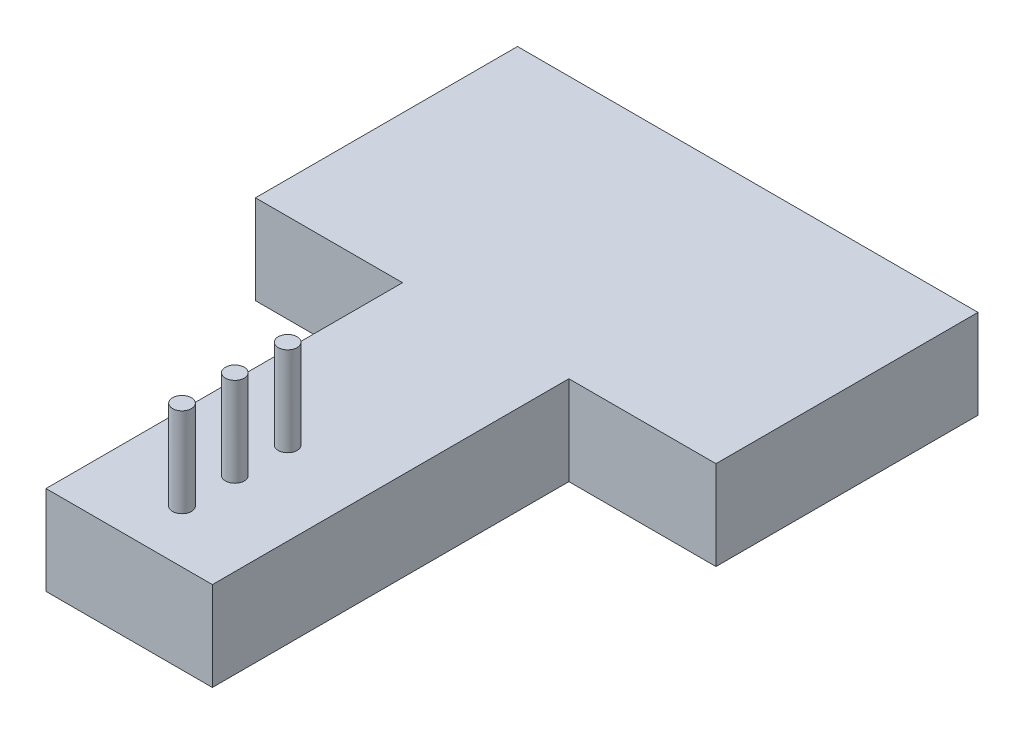
ISO-10303-21;
HEADER;
FILE_DESCRIPTION(('STEP AP214'),'2;1');
FILE_NAME('part.step','',(''),(''),'','','');
FILE_SCHEMA(('AUTOMOTIVE_DESIGN { 1 0 10303 214 1 1 1 1 }'));
ENDSEC;
DATA;
#1=APPLICATION_CONTEXT('core data for automotive mechanical design processes');
#2=APPLICATION_PROTOCOL_DEFINITION('international standard','automotive_design',2000,#1);
#3=PRODUCT_CONTEXT('',#1,'mechanical');
#4=PRODUCT('Part','Part','',(#3));
#5=PRODUCT_RELATED_PRODUCT_CATEGORY('part','',(#4));
#6=PRODUCT_DEFINITION_FORMATION('','',#4);
#7=PRODUCT_DEFINITION_CONTEXT('part definition',#1,'design');
#8=PRODUCT_DEFINITION('design','',#6,#7);
#9=PRODUCT_DEFINITION_SHAPE('','',#8);
#10=(LENGTH_UNIT() NAMED_UNIT(*) SI_UNIT(.MILLI.,.METRE.));
#11=(NAMED_UNIT(*) PLANE_ANGLE_UNIT() SI_UNIT($,.RADIAN.));
#12=(NAMED_UNIT(*) SI_UNIT($,.STERADIAN.) SOLID_ANGLE_UNIT());
#13=UNCERTAINTY_MEASURE_WITH_UNIT(LENGTH_MEASURE(1.E-05),#10,'distance_accuracy_value','');
#14=(GEOMETRIC_REPRESENTATION_CONTEXT(3) GLOBAL_UNCERTAINTY_ASSIGNED_CONTEXT((#13)) GLOBAL_UNIT_ASSIGNED_CONTEXT((#10,
#11,#12)) REPRESENTATION_CONTEXT('',''));
#15=CARTESIAN_POINT('',(0.,0.,0.));
#16=DIRECTION('',(0.,0.,1.));
#17=DIRECTION('',(1.,0.,0.));
#18=AXIS2_PLACEMENT_3D('',#15,#16,#17);
#19=CARTESIAN_POINT('',(-77.5,-30.,0.));
#20=DIRECTION('',(0.,0.,1.));
#21=DIRECTION('',(1.,0.,0.));
#22=AXIS2_PLACEMENT_3D('',#19,#20,#21);
#23=PLANE('',#22);
#24=DIRECTION('',(1.,0.,0.));
#25=VECTOR('',#24,1.);
#26=CARTESIAN_POINT('',(-77.5,0.,0.));
#27=LINE('',#26,#25);
#28=CARTESIAN_POINT('',(-77.5,0.,0.));
#29=VERTEX_POINT('',#28);
#30=CARTESIAN_POINT('',(-28.,0.,0.));
#31=VERTEX_POINT('',#30);
#32=EDGE_CURVE('E132',#29,#31,#27,.T.);
#33=ORIENTED_EDGE('',*,*,#32,.F.);
#34=DIRECTION('',(0.,1.,0.));
#35=VECTOR('',#34,1.);
#36=CARTESIAN_POINT('',(-77.5,-30.,0.));
#37=LINE('',#36,#35);
#38=CARTESIAN_POINT('',(-77.5,-30.,0.));
#39=VERTEX_POINT('',#38);
#40=EDGE_CURVE('E49',#39,#29,#37,.T.);
#41=ORIENTED_EDGE('',*,*,#40,.F.);
#42=DIRECTION('',(1.,0.,0.));
#43=VECTOR('',#42,1.);
#44=CARTESIAN_POINT('',(-77.5,-30.,0.));
#45=LINE('',#44,#43);
#46=CARTESIAN_POINT('',(-28.,-30.,0.));
#47=VERTEX_POINT('',#46);
#48=EDGE_CURVE('E154',#39,#47,#45,.T.);
#49=ORIENTED_EDGE('',*,*,#48,.T.);
#50=DIRECTION('',(0.,1.,0.));
#51=VECTOR('',#50,1.);
#52=CARTESIAN_POINT('',(-28.,-30.,0.));
#53=LINE('',#52,#51);
#54=EDGE_CURVE('E90',#47,#31,#53,.T.);
#55=ORIENTED_EDGE('',*,*,#54,.T.);
#56=EDGE_LOOP('',(#33,#41,#49,#55));
#57=FACE_BOUND('',#56,.T.);
#58=ADVANCED_FACE('F33',(#57),#23,.T.);
#59=CARTESIAN_POINT('',(-77.5,-30.,-88.2));
#60=DIRECTION('',(-1.,0.,0.));
#61=DIRECTION('',(0.,0.,1.));
#62=AXIS2_PLACEMENT_3D('',#59,#60,#61);
#63=PLANE('',#62);
#64=DIRECTION('',(0.,0.,1.));
#65=VECTOR('',#64,1.);
#66=CARTESIAN_POINT('',(-77.5,0.,-88.2));
#67=LINE('',#66,#65);
#68=CARTESIAN_POINT('',(-77.5,0.,-88.2));
#69=VERTEX_POINT('',#68);
#70=EDGE_CURVE('E151',#69,#29,#67,.T.);
#71=ORIENTED_EDGE('',*,*,#70,.F.);
#72=DIRECTION('',(0.,1.,0.));
#73=VECTOR('',#72,1.);
#74=CARTESIAN_POINT('',(-77.5,-30.,-88.2));
#75=LINE('',#74,#73);
#76=CARTESIAN_POINT('',(-77.5,-30.,-88.2));
#77=VERTEX_POINT('',#76);
#78=EDGE_CURVE('E78',#77,#69,#75,.T.);
#79=ORIENTED_EDGE('',*,*,#78,.F.);
#80=DIRECTION('',(0.,0.,1.));
#81=VECTOR('',#80,1.);
#82=CARTESIAN_POINT('',(-77.5,-30.,-88.2));
#83=LINE('',#82,#81);
#84=EDGE_CURVE('E122',#77,#39,#83,.T.);
#85=ORIENTED_EDGE('',*,*,#84,.T.);
#86=ORIENTED_EDGE('',*,*,#40,.T.);
#87=EDGE_LOOP('',(#71,#79,#85,#86));
#88=FACE_BOUND('',#87,.T.);
#89=ADVANCED_FACE('F195',(#88),#63,.T.);
#90=CARTESIAN_POINT('',(-77.5,-30.,-88.2));
#91=DIRECTION('',(0.,0.,-1.));
#92=DIRECTION('',(-1.,0.,0.));
#93=AXIS2_PLACEMENT_3D('',#90,#91,#92);
#94=PLANE('',#93);
#95=DIRECTION('',(-1.,0.,0.));
#96=VECTOR('',#95,1.);
#97=CARTESIAN_POINT('',(-77.5,0.,-88.2));
#98=LINE('',#97,#96);
#99=CARTESIAN_POINT('',(77.5,0.,-88.2));
#100=VERTEX_POINT('',#99);
#101=EDGE_CURVE('E109',#100,#69,#98,.T.);
#102=ORIENTED_EDGE('',*,*,#101,.F.);
#103=DIRECTION('',(0.,1.,0.));
#104=VECTOR('',#103,1.);
#105=CARTESIAN_POINT('',(77.5,-30.,-88.2));
#106=LINE('',#105,#104);
#107=CARTESIAN_POINT('',(77.5,-30.,-88.2));
#108=VERTEX_POINT('',#107);
#109=EDGE_CURVE('E104',#108,#100,#106,.T.);
#110=ORIENTED_EDGE('',*,*,#109,.F.);
#111=DIRECTION('',(-1.,0.,0.));
#112=VECTOR('',#111,1.);
#113=CARTESIAN_POINT('',(-77.5,-30.,-88.2));
#114=LINE('',#113,#112);
#115=EDGE_CURVE('E107',#108,#77,#114,.T.);
#116=ORIENTED_EDGE('',*,*,#115,.T.);
#117=ORIENTED_EDGE('',*,*,#78,.T.);
#118=EDGE_LOOP('',(#102,#110,#116,#117));
#119=FACE_BOUND('',#118,.T.);
#120=ADVANCED_FACE('F106',(#119),#94,.T.);
#121=CARTESIAN_POINT('',(77.5,-30.,-88.2));
#122=DIRECTION('',(1.,0.,0.));
#123=DIRECTION('',(0.,0.,-1.));
#124=AXIS2_PLACEMENT_3D('',#121,#122,#123);
#125=PLANE('',#124);
#126=DIRECTION('',(0.,0.,-1.));
#127=VECTOR('',#126,1.);
#128=CARTESIAN_POINT('',(77.5,0.,-88.2));
#129=LINE('',#128,#127);
#130=CARTESIAN_POINT('',(77.5,0.,0.));
#131=VERTEX_POINT('',#130);
#132=EDGE_CURVE('E148',#131,#100,#129,.T.);
#133=ORIENTED_EDGE('',*,*,#132,.F.);
#134=DIRECTION('',(0.,1.,0.));
#135=VECTOR('',#134,1.);
#136=CARTESIAN_POINT('',(77.5,-30.,0.));
#137=LINE('',#136,#135);
#138=CARTESIAN_POINT('',(77.5,-30.,0.));
#139=VERTEX_POINT('',#138);
#140=EDGE_CURVE('E114',#139,#131,#137,.T.);
#141=ORIENTED_EDGE('',*,*,#140,.F.);
#142=DIRECTION('',(0.,0.,-1.));
#143=VECTOR('',#142,1.);
#144=CARTESIAN_POINT('',(77.5,-30.,-88.2));
#145=LINE('',#144,#143);
#146=EDGE_CURVE('E120',#139,#108,#145,.T.);
#147=ORIENTED_EDGE('',*,*,#146,.T.);
#148=ORIENTED_EDGE('',*,*,#109,.T.);
#149=EDGE_LOOP('',(#133,#141,#147,#148));
#150=FACE_BOUND('',#149,.T.);
#151=ADVANCED_FACE('F124',(#150),#125,.T.);
#152=CARTESIAN_POINT('',(28.,-30.,0.));
#153=DIRECTION('',(0.,0.,1.));
#154=DIRECTION('',(1.,0.,0.));
#155=AXIS2_PLACEMENT_3D('',#152,#153,#154);
#156=PLANE('',#155);
#157=DIRECTION('',(1.,0.,0.));
#158=VECTOR('',#157,1.);
#159=CARTESIAN_POINT('',(28.,0.,0.));
#160=LINE('',#159,#158);
#161=CARTESIAN_POINT('',(28.,0.,0.));
#162=VERTEX_POINT('',#161);
#163=EDGE_CURVE('E145',#162,#131,#160,.T.);
#164=ORIENTED_EDGE('',*,*,#163,.F.);
#165=DIRECTION('',(0.,1.,0.));
#166=VECTOR('',#165,1.);
#167=CARTESIAN_POINT('',(28.,-30.,0.));
#168=LINE('',#167,#166);
#169=CARTESIAN_POINT('',(28.,-30.,0.));
#170=VERTEX_POINT('',#169);
#171=EDGE_CURVE('E159',#170,#162,#168,.T.);
#172=ORIENTED_EDGE('',*,*,#171,.F.);
#173=DIRECTION('',(1.,0.,0.));
#174=VECTOR('',#173,1.);
#175=CARTESIAN_POINT('',(28.,-30.,0.));
#176=LINE('',#175,#174);
#177=EDGE_CURVE('E125',#170,#139,#176,.T.);
#178=ORIENTED_EDGE('',*,*,#177,.T.);
#179=ORIENTED_EDGE('',*,*,#140,.T.);
#180=EDGE_LOOP('',(#164,#172,#178,#179));
#181=FACE_BOUND('',#180,.T.);
#182=ADVANCED_FACE('F194',(#181),#156,.T.);
#183=CARTESIAN_POINT('',(28.,-30.,0.));
#184=DIRECTION('',(1.,0.,0.));
#185=DIRECTION('',(0.,0.,-1.));
#186=AXIS2_PLACEMENT_3D('',#183,#184,#185);
#187=PLANE('',#186);
#188=DIRECTION('',(0.,0.,-1.));
#189=VECTOR('',#188,1.);
#190=CARTESIAN_POINT('',(28.,0.,0.));
#191=LINE('',#190,#189);
#192=CARTESIAN_POINT('',(28.,0.,120.));
#193=VERTEX_POINT('',#192);
#194=EDGE_CURVE('E142',#193,#162,#191,.T.);
#195=ORIENTED_EDGE('',*,*,#194,.F.);
#196=DIRECTION('',(0.,1.,0.));
#197=VECTOR('',#196,1.);
#198=CARTESIAN_POINT('',(28.,-30.,120.));
#199=LINE('',#198,#197);
#200=CARTESIAN_POINT('',(28.,-30.,120.));
#201=VERTEX_POINT('',#200);
#202=EDGE_CURVE('E161',#201,#193,#199,.T.);
#203=ORIENTED_EDGE('',*,*,#202,.F.);
#204=DIRECTION('',(0.,0.,-1.));
#205=VECTOR('',#204,1.);
#206=CARTESIAN_POINT('',(28.,-30.,0.));
#207=LINE('',#206,#205);
#208=EDGE_CURVE('E127',#201,#170,#207,.T.);
#209=ORIENTED_EDGE('',*,*,#208,.T.);
#210=ORIENTED_EDGE('',*,*,#171,.T.);
#211=EDGE_LOOP('',(#195,#203,#209,#210));
#212=FACE_BOUND('',#211,.T.);
#213=ADVANCED_FACE('F190',(#212),#187,.T.);
#214=CARTESIAN_POINT('',(-28.,-30.,120.));
#215=DIRECTION('',(0.,0.,1.));
#216=DIRECTION('',(1.,0.,0.));
#217=AXIS2_PLACEMENT_3D('',#214,#215,#216);
#218=PLANE('',#217);
#219=DIRECTION('',(1.,0.,0.));
#220=VECTOR('',#219,1.);
#221=CARTESIAN_POINT('',(-28.,0.,120.));
#222=LINE('',#221,#220);
#223=CARTESIAN_POINT('',(-28.,0.,120.));
#224=VERTEX_POINT('',#223);
#225=EDGE_CURVE('E139',#224,#193,#222,.T.);
#226=ORIENTED_EDGE('',*,*,#225,.F.);
#227=DIRECTION('',(0.,1.,0.));
#228=VECTOR('',#227,1.);
#229=CARTESIAN_POINT('',(-28.,-30.,120.));
#230=LINE('',#229,#228);
#231=CARTESIAN_POINT('',(-28.,-30.,120.));
#232=VERTEX_POINT('',#231);
#233=EDGE_CURVE('E163',#232,#224,#230,.T.);
#234=ORIENTED_EDGE('',*,*,#233,.F.);
#235=DIRECTION('',(1.,0.,0.));
#236=VECTOR('',#235,1.);
#237=CARTESIAN_POINT('',(-28.,-30.,120.));
#238=LINE('',#237,#236);
#239=EDGE_CURVE('E254',#232,#201,#238,.T.);
#240=ORIENTED_EDGE('',*,*,#239,.T.);
#241=ORIENTED_EDGE('',*,*,#202,.T.);
#242=EDGE_LOOP('',(#226,#234,#240,#241));
#243=FACE_BOUND('',#242,.T.);
#244=ADVANCED_FACE('F186',(#243),#218,.T.);
#245=CARTESIAN_POINT('',(-28.,-30.,0.));
#246=DIRECTION('',(-1.,0.,0.));
#247=DIRECTION('',(0.,0.,1.));
#248=AXIS2_PLACEMENT_3D('',#245,#246,#247);
#249=PLANE('',#248);
#250=DIRECTION('',(0.,0.,1.));
#251=VECTOR('',#250,1.);
#252=CARTESIAN_POINT('',(-28.,0.,0.));
#253=LINE('',#252,#251);
#254=EDGE_CURVE('E135',#31,#224,#253,.T.);
#255=ORIENTED_EDGE('',*,*,#254,.F.);
#256=ORIENTED_EDGE('',*,*,#54,.F.);
#257=DIRECTION('',(0.,0.,1.));
#258=VECTOR('',#257,1.);
#259=CARTESIAN_POINT('',(-28.,-30.,0.));
#260=LINE('',#259,#258);
#261=EDGE_CURVE('E182',#47,#232,#260,.T.);
#262=ORIENTED_EDGE('',*,*,#261,.T.);
#263=ORIENTED_EDGE('',*,*,#233,.T.);
#264=EDGE_LOOP('',(#255,#256,#262,#263));
#265=FACE_BOUND('',#264,.T.);
#266=ADVANCED_FACE('F180',(#265),#249,.T.);
#267=CARTESIAN_POINT('',(0.,-30.,0.));
#268=DIRECTION('',(0.,-1.,0.));
#269=DIRECTION('',(0.,0.,-1.));
#270=AXIS2_PLACEMENT_3D('',#267,#268,#269);
#271=PLANE('',#270);
#272=ORIENTED_EDGE('',*,*,#48,.F.);
#273=ORIENTED_EDGE('',*,*,#84,.F.);
#274=ORIENTED_EDGE('',*,*,#115,.F.);
#275=ORIENTED_EDGE('',*,*,#146,.F.);
#276=ORIENTED_EDGE('',*,*,#177,.F.);
#277=ORIENTED_EDGE('',*,*,#208,.F.);
#278=ORIENTED_EDGE('',*,*,#239,.F.);
#279=ORIENTED_EDGE('',*,*,#261,.F.);
#280=EDGE_LOOP('',(#272,#273,#274,#275,#276,#277,#278,#279));
#281=FACE_BOUND('',#280,.T.);
#282=ADVANCED_FACE('F118',(#281),#271,.T.);
#283=CARTESIAN_POINT('',(0.,0.,0.));
#284=DIRECTION('',(0.,-1.,0.));
#285=DIRECTION('',(0.,0.,-1.));
#286=AXIS2_PLACEMENT_3D('',#283,#284,#285);
#287=PLANE('',#286);
#288=CARTESIAN_POINT('',(0.,0.,102.22));
#289=DIRECTION('',(0.,-1.,0.));
#290=DIRECTION('',(0.,0.,-1.));
#291=AXIS2_PLACEMENT_3D('',#288,#289,#290);
#292=CIRCLE('',#291,3.175);
#293=CARTESIAN_POINT('',(0.,0.,99.045));
#294=VERTEX_POINT('',#293);
#295=EDGE_CURVE('E11',#294,#294,#292,.F.);
#296=ORIENTED_EDGE('',*,*,#295,.F.);
#297=EDGE_LOOP('',(#296));
#298=FACE_BOUND('',#297,.T.);
#299=CARTESIAN_POINT('',(0.,0.,66.66));
#300=DIRECTION('',(0.,-1.,0.));
#301=DIRECTION('',(0.,0.,-1.));
#302=AXIS2_PLACEMENT_3D('',#299,#300,#301);
#303=CIRCLE('',#302,3.175);
#304=CARTESIAN_POINT('',(0.,0.,63.485));
#305=VERTEX_POINT('',#304);
#306=EDGE_CURVE('E41',#305,#305,#303,.F.);
#307=ORIENTED_EDGE('',*,*,#306,.F.);
#308=EDGE_LOOP('',(#307));
#309=FACE_BOUND('',#308,.T.);
#310=CARTESIAN_POINT('',(0.,0.,84.44));
#311=DIRECTION('',(0.,-1.,0.));
#312=DIRECTION('',(0.,0.,-1.));
#313=AXIS2_PLACEMENT_3D('',#310,#311,#312);
#314=CIRCLE('',#313,3.175);
#315=CARTESIAN_POINT('',(0.,0.,81.265));
#316=VERTEX_POINT('',#315);
#317=EDGE_CURVE('E156',#316,#316,#314,.F.);
#318=ORIENTED_EDGE('',*,*,#317,.F.);
#319=EDGE_LOOP('',(#318));
#320=FACE_BOUND('',#319,.T.);
#321=ORIENTED_EDGE('',*,*,#32,.T.);
#322=ORIENTED_EDGE('',*,*,#254,.T.);
#323=ORIENTED_EDGE('',*,*,#225,.T.);
#324=ORIENTED_EDGE('',*,*,#194,.T.);
#325=ORIENTED_EDGE('',*,*,#163,.T.);
#326=ORIENTED_EDGE('',*,*,#132,.T.);
#327=ORIENTED_EDGE('',*,*,#101,.T.);
#328=ORIENTED_EDGE('',*,*,#70,.T.);
#329=EDGE_LOOP('',(#321,#322,#323,#324,#325,#326,#327,#328));
#330=FACE_BOUND('',#329,.T.);
#331=ADVANCED_FACE('F172',(#298,#309,#320,#330),#287,.F.);
#332=CARTESIAN_POINT('',(0.,30.,84.44));
#333=DIRECTION('',(0.,-1.,0.));
#334=DIRECTION('',(0.,0.,-1.));
#335=AXIS2_PLACEMENT_3D('',#332,#333,#334);
#336=CYLINDRICAL_SURFACE('',#335,3.175);
#337=CARTESIAN_POINT('',(0.,30.,84.44));
#338=DIRECTION('',(0.,1.,0.));
#339=DIRECTION('',(0.,0.,1.));
#340=AXIS2_PLACEMENT_3D('',#337,#338,#339);
#341=CIRCLE('',#340,3.175);
#342=CARTESIAN_POINT('',(0.,30.,87.615));
#343=VERTEX_POINT('',#342);
#344=EDGE_CURVE('E136',#343,#343,#341,.T.);
#345=ORIENTED_EDGE('',*,*,#344,.F.);
#346=EDGE_LOOP('',(#345));
#347=FACE_BOUND('',#346,.T.);
#348=ORIENTED_EDGE('',*,*,#317,.T.);
#349=EDGE_LOOP('',(#348));
#350=FACE_BOUND('',#349,.T.);
#351=ADVANCED_FACE('F175',(#347,#350),#336,.T.);
#352=CARTESIAN_POINT('',(0.,30.,84.44));
#353=DIRECTION('',(0.,1.,0.));
#354=DIRECTION('',(0.,0.,1.));
#355=AXIS2_PLACEMENT_3D('',#352,#353,#354);
#356=PLANE('',#355);
#357=ORIENTED_EDGE('',*,*,#344,.T.);
#358=EDGE_LOOP('',(#357));
#359=FACE_BOUND('',#358,.T.);
#360=ADVANCED_FACE('F221',(#359),#356,.T.);
#361=CARTESIAN_POINT('',(0.,30.,66.66));
#362=DIRECTION('',(0.,-1.,0.));
#363=DIRECTION('',(0.,0.,-1.));
#364=AXIS2_PLACEMENT_3D('',#361,#362,#363);
#365=CYLINDRICAL_SURFACE('',#364,3.175);
#366=CARTESIAN_POINT('',(0.,30.,66.66));
#367=DIRECTION('',(0.,1.,0.));
#368=DIRECTION('',(0.,0.,1.));
#369=AXIS2_PLACEMENT_3D('',#366,#367,#368);
#370=CIRCLE('',#369,3.175);
#371=CARTESIAN_POINT('',(0.,30.,69.835));
#372=VERTEX_POINT('',#371);
#373=EDGE_CURVE('E245',#372,#372,#370,.T.);
#374=ORIENTED_EDGE('',*,*,#373,.F.);
#375=EDGE_LOOP('',(#374));
#376=FACE_BOUND('',#375,.T.);
#377=ORIENTED_EDGE('',*,*,#306,.T.);
#378=EDGE_LOOP('',(#377));
#379=FACE_BOUND('',#378,.T.);
#380=ADVANCED_FACE('F170',(#376,#379),#365,.T.);
#381=CARTESIAN_POINT('',(0.,30.,66.66));
#382=DIRECTION('',(0.,1.,0.));
#383=DIRECTION('',(0.,0.,1.));
#384=AXIS2_PLACEMENT_3D('',#381,#382,#383);
#385=PLANE('',#384);
#386=ORIENTED_EDGE('',*,*,#373,.T.);
#387=EDGE_LOOP('',(#386));
#388=FACE_BOUND('',#387,.T.);
#389=ADVANCED_FACE('F228',(#388),#385,.T.);
#390=CARTESIAN_POINT('',(0.,30.,102.22));
#391=DIRECTION('',(0.,-1.,0.));
#392=DIRECTION('',(0.,0.,-1.));
#393=AXIS2_PLACEMENT_3D('',#390,#391,#392);
#394=CYLINDRICAL_SURFACE('',#393,3.175);
#395=CARTESIAN_POINT('',(0.,30.,102.22));
#396=DIRECTION('',(0.,1.,0.));
#397=DIRECTION('',(0.,0.,1.));
#398=AXIS2_PLACEMENT_3D('',#395,#396,#397);
#399=CIRCLE('',#398,3.175);
#400=CARTESIAN_POINT('',(0.,30.,105.395));
#401=VERTEX_POINT('',#400);
#402=EDGE_CURVE('E244',#401,#401,#399,.T.);
#403=ORIENTED_EDGE('',*,*,#402,.F.);
#404=EDGE_LOOP('',(#403));
#405=FACE_BOUND('',#404,.T.);
#406=ORIENTED_EDGE('',*,*,#295,.T.);
#407=EDGE_LOOP('',(#406));
#408=FACE_BOUND('',#407,.T.);
#409=ADVANCED_FACE('F232',(#405,#408),#394,.T.);
#410=CARTESIAN_POINT('',(0.,30.,102.22));
#411=DIRECTION('',(0.,1.,0.));
#412=DIRECTION('',(0.,0.,1.));
#413=AXIS2_PLACEMENT_3D('',#410,#411,#412);
#414=PLANE('',#413);
#415=ORIENTED_EDGE('',*,*,#402,.T.);
#416=EDGE_LOOP('',(#415));
#417=FACE_BOUND('',#416,.T.);
#418=ADVANCED_FACE('F236',(#417),#414,.T.);
#419=CLOSED_SHELL('',(#58,#89,#120,#151,#182,#213,#244,#266,#282,#331,#351,#360,#380,#389,#409,#418));
#420=MANIFOLD_SOLID_BREP('B2',#419);
#421=ADVANCED_BREP_SHAPE_REPRESENTATION('',(#18,#420),#14);
#422=SHAPE_DEFINITION_REPRESENTATION(#9,#421);
ENDSEC;
END-ISO-10303-21;
